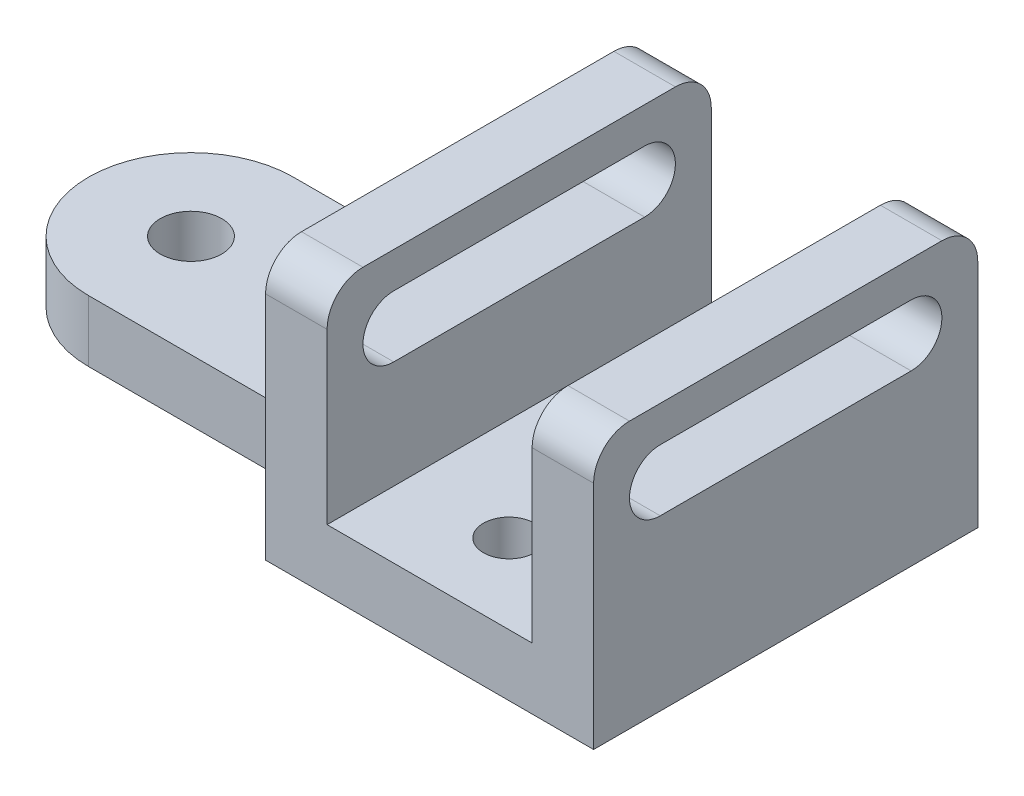
ISO-10303-21;
HEADER;
FILE_DESCRIPTION(('STEP AP214'),'2;1');
FILE_NAME('part.step','',(''),(''),'','','');
FILE_SCHEMA(('AUTOMOTIVE_DESIGN { 1 0 10303 214 1 1 1 1 }'));
ENDSEC;
DATA;
#1=APPLICATION_CONTEXT('core data for automotive mechanical design processes');
#2=APPLICATION_PROTOCOL_DEFINITION('international standard','automotive_design',2000,#1);
#3=PRODUCT_CONTEXT('',#1,'mechanical');
#4=PRODUCT('Part','Part','',(#3));
#5=PRODUCT_RELATED_PRODUCT_CATEGORY('part','',(#4));
#6=PRODUCT_DEFINITION_FORMATION('','',#4);
#7=PRODUCT_DEFINITION_CONTEXT('part definition',#1,'design');
#8=PRODUCT_DEFINITION('design','',#6,#7);
#9=PRODUCT_DEFINITION_SHAPE('','',#8);
#10=(LENGTH_UNIT() NAMED_UNIT(*) SI_UNIT(.MILLI.,.METRE.));
#11=(NAMED_UNIT(*) PLANE_ANGLE_UNIT() SI_UNIT($,.RADIAN.));
#12=(NAMED_UNIT(*) SI_UNIT($,.STERADIAN.) SOLID_ANGLE_UNIT());
#13=UNCERTAINTY_MEASURE_WITH_UNIT(LENGTH_MEASURE(1.E-05),#10,'distance_accuracy_value','');
#14=(GEOMETRIC_REPRESENTATION_CONTEXT(3) GLOBAL_UNCERTAINTY_ASSIGNED_CONTEXT((#13)) GLOBAL_UNIT_ASSIGNED_CONTEXT((#10,
#11,#12)) REPRESENTATION_CONTEXT('',''));
#15=CARTESIAN_POINT('',(0.,0.,0.));
#16=DIRECTION('',(0.,0.,1.));
#17=DIRECTION('',(1.,0.,0.));
#18=AXIS2_PLACEMENT_3D('',#15,#16,#17);
#19=CARTESIAN_POINT('',(-113.533874762292,12.,0.));
#20=DIRECTION('',(1.,0.,0.));
#21=DIRECTION('',(0.,0.,-1.));
#22=AXIS2_PLACEMENT_3D('',#19,#20,#21);
#23=PLANE('',#22);
#24=DIRECTION('',(0.,0.,1.));
#25=VECTOR('',#24,1.);
#26=CARTESIAN_POINT('',(-113.533874762292,0.,0.));
#27=LINE('',#26,#25);
#28=CARTESIAN_POINT('',(-113.533874762292,0.,-40.2426295868931));
#29=VERTEX_POINT('',#28);
#30=CARTESIAN_POINT('',(-113.533874762292,0.,-30.6817293777094));
#31=VERTEX_POINT('',#30);
#32=EDGE_CURVE('E518',#29,#31,#27,.T.);
#33=ORIENTED_EDGE('',*,*,#32,.T.);
#34=DIRECTION('',(0.,-1.,0.));
#35=VECTOR('',#34,1.);
#36=CARTESIAN_POINT('',(-113.533874762292,12.,-30.6817293777094));
#37=LINE('',#36,#35);
#38=CARTESIAN_POINT('',(-113.533874762292,12.,-30.6817293777094));
#39=VERTEX_POINT('',#38);
#40=EDGE_CURVE('E523',#39,#31,#37,.T.);
#41=ORIENTED_EDGE('',*,*,#40,.F.);
#42=DIRECTION('',(0.,0.,-1.));
#43=VECTOR('',#42,1.);
#44=CARTESIAN_POINT('',(-113.533874762292,12.,34.7573704131069));
#45=LINE('',#44,#43);
#46=CARTESIAN_POINT('',(-113.533874762292,12.,29.3182706222906));
#47=VERTEX_POINT('',#46);
#48=EDGE_CURVE('E249',#47,#39,#45,.T.);
#49=ORIENTED_EDGE('',*,*,#48,.F.);
#50=DIRECTION('',(0.,-1.,0.));
#51=VECTOR('',#50,1.);
#52=CARTESIAN_POINT('',(-113.533874762292,12.,29.3182706222906));
#53=LINE('',#52,#51);
#54=CARTESIAN_POINT('',(-113.533874762292,0.,29.3182706222906));
#55=VERTEX_POINT('',#54);
#56=EDGE_CURVE('E534',#47,#55,#53,.T.);
#57=ORIENTED_EDGE('',*,*,#56,.T.);
#58=DIRECTION('',(0.,0.,1.));
#59=VECTOR('',#58,1.);
#60=CARTESIAN_POINT('',(-113.533874762292,0.,0.));
#61=LINE('',#60,#59);
#62=CARTESIAN_POINT('',(-113.533874762292,0.,34.7573704131069));
#63=VERTEX_POINT('',#62);
#64=EDGE_CURVE('E507',#55,#63,#61,.T.);
#65=ORIENTED_EDGE('',*,*,#64,.T.);
#66=DIRECTION('',(0.,-1.,0.));
#67=VECTOR('',#66,1.);
#68=CARTESIAN_POINT('',(-113.533874762292,12.,34.7573704131069));
#69=LINE('',#68,#67);
#70=CARTESIAN_POINT('',(-113.533874762292,45.,34.7573704131069));
#71=VERTEX_POINT('',#70);
#72=EDGE_CURVE('E531',#71,#63,#69,.T.);
#73=ORIENTED_EDGE('',*,*,#72,.F.);
#74=CARTESIAN_POINT('',(-113.533874762292,45.,27.7573704131069));
#75=DIRECTION('',(1.,0.,0.));
#76=DIRECTION('',(0.,0.,1.));
#77=AXIS2_PLACEMENT_3D('',#74,#75,#76);
#78=CIRCLE('',#77,7.);
#79=CARTESIAN_POINT('',(-113.533874762292,52.,27.7573704131069));
#80=VERTEX_POINT('',#79);
#81=EDGE_CURVE('E242',#80,#71,#78,.T.);
#82=ORIENTED_EDGE('',*,*,#81,.F.);
#83=DIRECTION('',(0.,0.,1.));
#84=VECTOR('',#83,1.);
#85=CARTESIAN_POINT('',(-113.533874762292,52.,27.7573704131069));
#86=LINE('',#85,#84);
#87=CARTESIAN_POINT('',(-113.533874762292,52.,-33.1995916793253));
#88=VERTEX_POINT('',#87);
#89=EDGE_CURVE('E263',#88,#80,#86,.T.);
#90=ORIENTED_EDGE('',*,*,#89,.F.);
#91=CARTESIAN_POINT('',(-113.533874762292,45.,-33.1995916793254));
#92=DIRECTION('',(1.,0.,0.));
#93=DIRECTION('',(0.,0.,-1.));
#94=AXIS2_PLACEMENT_3D('',#91,#92,#93);
#95=CIRCLE('',#94,7.);
#96=CARTESIAN_POINT('',(-113.533874762292,45.,-40.1995916793254));
#97=VERTEX_POINT('',#96);
#98=EDGE_CURVE('E265',#97,#88,#95,.T.);
#99=ORIENTED_EDGE('',*,*,#98,.F.);
#100=DIRECTION('',(0.,1.,0.));
#101=VECTOR('',#100,1.);
#102=CARTESIAN_POINT('',(-113.533874762292,12.,-40.1995916793254));
#103=LINE('',#102,#101);
#104=CARTESIAN_POINT('',(-113.533874762292,12.,-40.1995916793254));
#105=VERTEX_POINT('',#104);
#106=EDGE_CURVE('E267',#105,#97,#103,.T.);
#107=ORIENTED_EDGE('',*,*,#106,.F.);
#108=DIRECTION('',(0.,0.,1.));
#109=VECTOR('',#108,1.);
#110=CARTESIAN_POINT('',(-113.533874762292,12.,0.));
#111=LINE('',#110,#109);
#112=CARTESIAN_POINT('',(-113.533874762292,12.,-40.2426295868931));
#113=VERTEX_POINT('',#112);
#114=EDGE_CURVE('E593',#113,#105,#111,.T.);
#115=ORIENTED_EDGE('',*,*,#114,.F.);
#116=DIRECTION('',(0.,-1.,0.));
#117=VECTOR('',#116,1.);
#118=CARTESIAN_POINT('',(-113.533874762292,12.,-40.2426295868931));
#119=LINE('',#118,#117);
#120=EDGE_CURVE('E525',#113,#29,#119,.T.);
#121=ORIENTED_EDGE('',*,*,#120,.T.);
#122=EDGE_LOOP('',(#33,#41,#49,#57,#65,#73,#82,#90,#99,#107,#115,#121));
#123=FACE_BOUND('',#122,.T.);
#124=CARTESIAN_POINT('',(-113.533874762292,39.,21.7573704131069));
#125=DIRECTION('',(1.,0.,0.));
#126=DIRECTION('',(0.,0.,-1.));
#127=AXIS2_PLACEMENT_3D('',#124,#125,#126);
#128=CIRCLE('',#127,5.99999999999999);
#129=CARTESIAN_POINT('',(-113.533874762292,45.,21.7573704131069));
#130=VERTEX_POINT('',#129);
#131=CARTESIAN_POINT('',(-113.533874762292,33.,21.7573704131069));
#132=VERTEX_POINT('',#131);
#133=EDGE_CURVE('E48',#130,#132,#128,.T.);
#134=ORIENTED_EDGE('',*,*,#133,.T.);
#135=DIRECTION('',(0.,0.,-1.));
#136=VECTOR('',#135,1.);
#137=CARTESIAN_POINT('',(-113.533874762292,33.,21.7573704131069));
#138=LINE('',#137,#136);
#139=CARTESIAN_POINT('',(-113.533874762292,33.,-27.1995916793254));
#140=VERTEX_POINT('',#139);
#141=EDGE_CURVE('E235',#132,#140,#138,.T.);
#142=ORIENTED_EDGE('',*,*,#141,.T.);
#143=CARTESIAN_POINT('',(-113.533874762292,39.,-27.1995916793254));
#144=DIRECTION('',(1.,0.,0.));
#145=DIRECTION('',(0.,0.,-1.));
#146=AXIS2_PLACEMENT_3D('',#143,#144,#145);
#147=CIRCLE('',#146,6.);
#148=CARTESIAN_POINT('',(-113.533874762292,45.,-27.1995916793254));
#149=VERTEX_POINT('',#148);
#150=EDGE_CURVE('E221',#140,#149,#147,.T.);
#151=ORIENTED_EDGE('',*,*,#150,.T.);
#152=DIRECTION('',(0.,0.,1.));
#153=VECTOR('',#152,1.);
#154=CARTESIAN_POINT('',(-113.533874762292,45.,21.7573704131069));
#155=LINE('',#154,#153);
#156=EDGE_CURVE('E230',#149,#130,#155,.T.);
#157=ORIENTED_EDGE('',*,*,#156,.T.);
#158=EDGE_LOOP('',(#134,#142,#151,#157));
#159=FACE_BOUND('',#158,.T.);
#160=ADVANCED_FACE('F33',(#123,#159),#23,.F.);
#161=CARTESIAN_POINT('',(-101.533874762292,45.,27.7573704131069));
#162=DIRECTION('',(1.,0.,0.));
#163=DIRECTION('',(0.,0.,1.));
#164=AXIS2_PLACEMENT_3D('',#161,#162,#163);
#165=PLANE('',#164);
#166=DIRECTION('',(0.,-1.,0.));
#167=VECTOR('',#166,1.);
#168=CARTESIAN_POINT('',(-101.533874762292,12.,34.7573704131069));
#169=LINE('',#168,#167);
#170=CARTESIAN_POINT('',(-101.533874762292,45.,34.7573704131069));
#171=VERTEX_POINT('',#170);
#172=CARTESIAN_POINT('',(-101.533874762292,12.,34.7573704131069));
#173=VERTEX_POINT('',#172);
#174=EDGE_CURVE('E245',#171,#173,#169,.T.);
#175=ORIENTED_EDGE('',*,*,#174,.T.);
#176=DIRECTION('',(0.,0.,-1.));
#177=VECTOR('',#176,1.);
#178=CARTESIAN_POINT('',(-101.533874762292,12.,34.7573704131069));
#179=LINE('',#178,#177);
#180=CARTESIAN_POINT('',(-101.533874762292,12.,-40.1995916793254));
#181=VERTEX_POINT('',#180);
#182=EDGE_CURVE('E257',#173,#181,#179,.T.);
#183=ORIENTED_EDGE('',*,*,#182,.T.);
#184=DIRECTION('',(0.,1.,0.));
#185=VECTOR('',#184,1.);
#186=CARTESIAN_POINT('',(-101.533874762292,12.,-40.1995916793254));
#187=LINE('',#186,#185);
#188=CARTESIAN_POINT('',(-101.533874762292,45.,-40.1995916793254));
#189=VERTEX_POINT('',#188);
#190=EDGE_CURVE('E255',#181,#189,#187,.T.);
#191=ORIENTED_EDGE('',*,*,#190,.T.);
#192=CARTESIAN_POINT('',(-101.533874762292,45.,-33.1995916793254));
#193=DIRECTION('',(1.,0.,0.));
#194=DIRECTION('',(0.,0.,-1.));
#195=AXIS2_PLACEMENT_3D('',#192,#193,#194);
#196=CIRCLE('',#195,7.);
#197=CARTESIAN_POINT('',(-101.533874762292,52.,-33.1995916793253));
#198=VERTEX_POINT('',#197);
#199=EDGE_CURVE('E253',#189,#198,#196,.T.);
#200=ORIENTED_EDGE('',*,*,#199,.T.);
#201=DIRECTION('',(0.,0.,1.));
#202=VECTOR('',#201,1.);
#203=CARTESIAN_POINT('',(-101.533874762292,52.,27.7573704131069));
#204=LINE('',#203,#202);
#205=CARTESIAN_POINT('',(-101.533874762292,52.,27.7573704131069));
#206=VERTEX_POINT('',#205);
#207=EDGE_CURVE('E251',#198,#206,#204,.T.);
#208=ORIENTED_EDGE('',*,*,#207,.T.);
#209=CARTESIAN_POINT('',(-101.533874762292,45.,27.7573704131069));
#210=DIRECTION('',(1.,0.,0.));
#211=DIRECTION('',(0.,0.,1.));
#212=AXIS2_PLACEMENT_3D('',#209,#210,#211);
#213=CIRCLE('',#212,7.);
#214=EDGE_CURVE('E248',#206,#171,#213,.T.);
#215=ORIENTED_EDGE('',*,*,#214,.T.);
#216=EDGE_LOOP('',(#175,#183,#191,#200,#208,#215));
#217=FACE_BOUND('',#216,.T.);
#218=DIRECTION('',(0.,0.,1.));
#219=VECTOR('',#218,1.);
#220=CARTESIAN_POINT('',(-101.533874762292,33.,27.7573704131069));
#221=LINE('',#220,#219);
#222=CARTESIAN_POINT('',(-101.533874762292,33.,-27.1995916793254));
#223=VERTEX_POINT('',#222);
#224=CARTESIAN_POINT('',(-101.533874762292,33.,21.7573704131069));
#225=VERTEX_POINT('',#224);
#226=EDGE_CURVE('E41',#223,#225,#221,.T.);
#227=ORIENTED_EDGE('',*,*,#226,.T.);
#228=CARTESIAN_POINT('',(-101.533874762292,39.,21.7573704131069));
#229=DIRECTION('',(1.,0.,0.));
#230=DIRECTION('',(0.,0.,-1.));
#231=AXIS2_PLACEMENT_3D('',#228,#229,#230);
#232=CIRCLE('',#231,5.99999999999999);
#233=CARTESIAN_POINT('',(-101.533874762292,45.,21.7573704131069));
#234=VERTEX_POINT('',#233);
#235=EDGE_CURVE('E11',#225,#234,#232,.F.);
#236=ORIENTED_EDGE('',*,*,#235,.T.);
#237=DIRECTION('',(0.,0.,-1.));
#238=VECTOR('',#237,1.);
#239=CARTESIAN_POINT('',(-101.533874762292,45.,27.7573704131069));
#240=LINE('',#239,#238);
#241=CARTESIAN_POINT('',(-101.533874762292,45.,-27.1995916793254));
#242=VERTEX_POINT('',#241);
#243=EDGE_CURVE('E368',#234,#242,#240,.T.);
#244=ORIENTED_EDGE('',*,*,#243,.T.);
#245=CARTESIAN_POINT('',(-101.533874762292,39.,-27.1995916793254));
#246=DIRECTION('',(1.,0.,0.));
#247=DIRECTION('',(0.,0.,-1.));
#248=AXIS2_PLACEMENT_3D('',#245,#246,#247);
#249=CIRCLE('',#248,6.);
#250=EDGE_CURVE('E224',#242,#223,#249,.F.);
#251=ORIENTED_EDGE('',*,*,#250,.T.);
#252=EDGE_LOOP('',(#227,#236,#244,#251));
#253=FACE_BOUND('',#252,.T.);
#254=ADVANCED_FACE('F430',(#217,#253),#165,.T.);
#255=CARTESIAN_POINT('',(0.,12.,0.));
#256=DIRECTION('',(0.,1.,0.));
#257=DIRECTION('',(0.,0.,1.));
#258=AXIS2_PLACEMENT_3D('',#255,#256,#257);
#259=PLANE('',#258);
#260=CARTESIAN_POINT('',(-81.533874762292,12.,19.2573704131069));
#261=DIRECTION('',(0.,1.,0.));
#262=DIRECTION('',(0.,0.,1.));
#263=AXIS2_PLACEMENT_3D('',#260,#261,#262);
#264=CIRCLE('',#263,5.);
#265=CARTESIAN_POINT('',(-81.533874762292,12.,24.2573704131069));
#266=VERTEX_POINT('',#265);
#267=EDGE_CURVE('E342',#266,#266,#264,.T.);
#268=ORIENTED_EDGE('',*,*,#267,.F.);
#269=EDGE_LOOP('',(#268));
#270=FACE_BOUND('',#269,.T.);
#271=CARTESIAN_POINT('',(-81.533874762292,12.,-24.7426295868931));
#272=DIRECTION('',(0.,1.,0.));
#273=DIRECTION('',(0.,0.,1.));
#274=AXIS2_PLACEMENT_3D('',#271,#272,#273);
#275=CIRCLE('',#274,5.);
#276=CARTESIAN_POINT('',(-81.533874762292,12.,-19.7426295868931));
#277=VERTEX_POINT('',#276);
#278=EDGE_CURVE('E482',#277,#277,#275,.T.);
#279=ORIENTED_EDGE('',*,*,#278,.F.);
#280=EDGE_LOOP('',(#279));
#281=FACE_BOUND('',#280,.T.);
#282=ORIENTED_EDGE('',*,*,#114,.T.);
#283=DIRECTION('',(-1.,0.,0.));
#284=VECTOR('',#283,1.);
#285=CARTESIAN_POINT('',(-101.533874762292,12.,-40.1995916793254));
#286=LINE('',#285,#284);
#287=EDGE_CURVE('E271',#181,#105,#286,.T.);
#288=ORIENTED_EDGE('',*,*,#287,.F.);
#289=ORIENTED_EDGE('',*,*,#182,.F.);
#290=DIRECTION('',(1.,0.,0.));
#291=VECTOR('',#290,1.);
#292=CARTESIAN_POINT('',(0.,12.,34.7573704131069));
#293=LINE('',#292,#291);
#294=CARTESIAN_POINT('',(-61.533874762292,12.,34.7573704131069));
#295=VERTEX_POINT('',#294);
#296=EDGE_CURVE('E369',#173,#295,#293,.T.);
#297=ORIENTED_EDGE('',*,*,#296,.T.);
#298=DIRECTION('',(0.,0.,-1.));
#299=VECTOR('',#298,1.);
#300=CARTESIAN_POINT('',(-61.533874762292,12.,34.7573704131069));
#301=LINE('',#300,#299);
#302=CARTESIAN_POINT('',(-61.533874762292,12.,-40.1995916793254));
#303=VERTEX_POINT('',#302);
#304=EDGE_CURVE('E310',#295,#303,#301,.T.);
#305=ORIENTED_EDGE('',*,*,#304,.T.);
#306=DIRECTION('',(1.,0.,0.));
#307=VECTOR('',#306,1.);
#308=CARTESIAN_POINT('',(-61.533874762292,12.,-40.1995916793254));
#309=LINE('',#308,#307);
#310=CARTESIAN_POINT('',(-49.533874762292,12.,-40.1995916793254));
#311=VERTEX_POINT('',#310);
#312=EDGE_CURVE('E319',#303,#311,#309,.T.);
#313=ORIENTED_EDGE('',*,*,#312,.T.);
#314=DIRECTION('',(0.,0.,1.));
#315=VECTOR('',#314,1.);
#316=CARTESIAN_POINT('',(-49.533874762292,12.,0.));
#317=LINE('',#316,#315);
#318=CARTESIAN_POINT('',(-49.533874762292,12.,-40.2426295868931));
#319=VERTEX_POINT('',#318);
#320=EDGE_CURVE('E372',#319,#311,#317,.T.);
#321=ORIENTED_EDGE('',*,*,#320,.F.);
#322=DIRECTION('',(1.,0.,0.));
#323=VECTOR('',#322,1.);
#324=CARTESIAN_POINT('',(0.,12.,-40.2426295868931));
#325=LINE('',#324,#323);
#326=EDGE_CURVE('E381',#113,#319,#325,.T.);
#327=ORIENTED_EDGE('',*,*,#326,.F.);
#328=EDGE_LOOP('',(#282,#288,#289,#297,#305,#313,#321,#327));
#329=FACE_BOUND('',#328,.T.);
#330=ADVANCED_FACE('F397',(#270,#281,#329),#259,.T.);
#331=CARTESIAN_POINT('',(-163.533874762292,12.,-0.681729377709366));
#332=DIRECTION('',(0.,1.,0.));
#333=DIRECTION('',(0.,0.,1.));
#334=AXIS2_PLACEMENT_3D('',#331,#332,#333);
#335=CIRCLE('',#334,6.00000000000002);
#336=CARTESIAN_POINT('',(-163.533874762292,12.,5.31827062229065));
#337=VERTEX_POINT('',#336);
#338=EDGE_CURVE('E526',#337,#337,#335,.T.);
#339=ORIENTED_EDGE('',*,*,#338,.F.);
#340=EDGE_LOOP('',(#339));
#341=FACE_BOUND('',#340,.T.);
#342=CARTESIAN_POINT('',(-123.533874762292,12.,29.3182706222906));
#343=DIRECTION('',(0.,1.,0.));
#344=DIRECTION('',(0.,0.,1.));
#345=AXIS2_PLACEMENT_3D('',#342,#343,#344);
#346=CIRCLE('',#345,9.99999999999999);
#347=CARTESIAN_POINT('',(-123.533874762292,12.,19.3182706222906));
#348=VERTEX_POINT('',#347);
#349=EDGE_CURVE('E373',#348,#47,#346,.F.);
#350=ORIENTED_EDGE('',*,*,#349,.T.);
#351=ORIENTED_EDGE('',*,*,#48,.T.);
#352=CARTESIAN_POINT('',(-123.533874762292,12.,-30.6817293777094));
#353=DIRECTION('',(0.,1.,0.));
#354=DIRECTION('',(0.,0.,1.));
#355=AXIS2_PLACEMENT_3D('',#352,#353,#354);
#356=CIRCLE('',#355,9.99999999999999);
#357=CARTESIAN_POINT('',(-123.533874762292,12.,-20.6817293777094));
#358=VERTEX_POINT('',#357);
#359=EDGE_CURVE('E564',#358,#39,#356,.T.);
#360=ORIENTED_EDGE('',*,*,#359,.F.);
#361=DIRECTION('',(1.,0.,0.));
#362=VECTOR('',#361,1.);
#363=CARTESIAN_POINT('',(0.,12.,-20.6817293777094));
#364=LINE('',#363,#362);
#365=CARTESIAN_POINT('',(-163.533874762292,12.,-20.6817293777094));
#366=VERTEX_POINT('',#365);
#367=EDGE_CURVE('E549',#366,#358,#364,.T.);
#368=ORIENTED_EDGE('',*,*,#367,.F.);
#369=CARTESIAN_POINT('',(-163.533874762292,12.,-0.681729377709366));
#370=DIRECTION('',(0.,1.,0.));
#371=DIRECTION('',(0.,0.,1.));
#372=AXIS2_PLACEMENT_3D('',#369,#370,#371);
#373=CIRCLE('',#372,20.);
#374=CARTESIAN_POINT('',(-163.533874762292,12.,19.3182706222906));
#375=VERTEX_POINT('',#374);
#376=EDGE_CURVE('E558',#366,#375,#373,.T.);
#377=ORIENTED_EDGE('',*,*,#376,.T.);
#378=DIRECTION('',(1.,0.,0.));
#379=VECTOR('',#378,1.);
#380=CARTESIAN_POINT('',(0.,12.,19.3182706222906));
#381=LINE('',#380,#379);
#382=EDGE_CURVE('E561',#375,#348,#381,.T.);
#383=ORIENTED_EDGE('',*,*,#382,.T.);
#384=EDGE_LOOP('',(#350,#351,#360,#368,#377,#383));
#385=FACE_BOUND('',#384,.T.);
#386=ADVANCED_FACE('F471',(#341,#385),#259,.T.);
#387=CARTESIAN_POINT('',(-123.533874762292,12.,-30.6817293777094));
#388=DIRECTION('',(0.,-1.,0.));
#389=DIRECTION('',(0.,0.,-1.));
#390=AXIS2_PLACEMENT_3D('',#387,#388,#389);
#391=CYLINDRICAL_SURFACE('',#390,9.99999999999999);
#392=CARTESIAN_POINT('',(-123.533874762292,0.,-30.6817293777094));
#393=DIRECTION('',(0.,1.,0.));
#394=DIRECTION('',(0.,0.,1.));
#395=AXIS2_PLACEMENT_3D('',#392,#393,#394);
#396=CIRCLE('',#395,9.99999999999999);
#397=CARTESIAN_POINT('',(-123.533874762292,0.,-20.6817293777094));
#398=VERTEX_POINT('',#397);
#399=EDGE_CURVE('E487',#398,#31,#396,.T.);
#400=ORIENTED_EDGE('',*,*,#399,.F.);
#401=DIRECTION('',(0.,-1.,0.));
#402=VECTOR('',#401,1.);
#403=CARTESIAN_POINT('',(-123.533874762292,12.,-20.6817293777094));
#404=LINE('',#403,#402);
#405=EDGE_CURVE('E361',#358,#398,#404,.T.);
#406=ORIENTED_EDGE('',*,*,#405,.F.);
#407=ORIENTED_EDGE('',*,*,#359,.T.);
#408=ORIENTED_EDGE('',*,*,#40,.T.);
#409=EDGE_LOOP('',(#400,#406,#407,#408));
#410=FACE_BOUND('',#409,.T.);
#411=ADVANCED_FACE('F468',(#410),#391,.F.);
#412=CARTESIAN_POINT('',(0.,12.,-20.6817293777094));
#413=DIRECTION('',(0.,0.,-1.));
#414=DIRECTION('',(-1.,0.,0.));
#415=AXIS2_PLACEMENT_3D('',#412,#413,#414);
#416=PLANE('',#415);
#417=DIRECTION('',(1.,0.,0.));
#418=VECTOR('',#417,1.);
#419=CARTESIAN_POINT('',(0.,0.,-20.6817293777094));
#420=LINE('',#419,#418);
#421=CARTESIAN_POINT('',(-163.533874762292,0.,-20.6817293777094));
#422=VERTEX_POINT('',#421);
#423=EDGE_CURVE('E490',#422,#398,#420,.T.);
#424=ORIENTED_EDGE('',*,*,#423,.F.);
#425=DIRECTION('',(0.,-1.,0.));
#426=VECTOR('',#425,1.);
#427=CARTESIAN_POINT('',(-163.533874762292,12.,-20.6817293777094));
#428=LINE('',#427,#426);
#429=EDGE_CURVE('E542',#366,#422,#428,.T.);
#430=ORIENTED_EDGE('',*,*,#429,.F.);
#431=ORIENTED_EDGE('',*,*,#367,.T.);
#432=ORIENTED_EDGE('',*,*,#405,.T.);
#433=EDGE_LOOP('',(#424,#430,#431,#432));
#434=FACE_BOUND('',#433,.T.);
#435=ADVANCED_FACE('F464',(#434),#416,.T.);
#436=CARTESIAN_POINT('',(-163.533874762292,12.,-0.681729377709366));
#437=DIRECTION('',(0.,-1.,0.));
#438=DIRECTION('',(0.,0.,-1.));
#439=AXIS2_PLACEMENT_3D('',#436,#437,#438);
#440=CYLINDRICAL_SURFACE('',#439,20.);
#441=CARTESIAN_POINT('',(-163.533874762292,0.,-0.681729377709366));
#442=DIRECTION('',(0.,1.,0.));
#443=DIRECTION('',(0.,0.,1.));
#444=AXIS2_PLACEMENT_3D('',#441,#442,#443);
#445=CIRCLE('',#444,20.);
#446=CARTESIAN_POINT('',(-163.533874762292,0.,19.3182706222906));
#447=VERTEX_POINT('',#446);
#448=EDGE_CURVE('E498',#422,#447,#445,.T.);
#449=ORIENTED_EDGE('',*,*,#448,.T.);
#450=DIRECTION('',(0.,-1.,0.));
#451=VECTOR('',#450,1.);
#452=CARTESIAN_POINT('',(-163.533874762292,12.,19.3182706222906));
#453=LINE('',#452,#451);
#454=EDGE_CURVE('E540',#375,#447,#453,.T.);
#455=ORIENTED_EDGE('',*,*,#454,.F.);
#456=ORIENTED_EDGE('',*,*,#376,.F.);
#457=ORIENTED_EDGE('',*,*,#429,.T.);
#458=EDGE_LOOP('',(#449,#455,#456,#457));
#459=FACE_BOUND('',#458,.T.);
#460=ADVANCED_FACE('F460',(#459),#440,.T.);
#461=CARTESIAN_POINT('',(0.,12.,19.3182706222906));
#462=DIRECTION('',(0.,0.,-1.));
#463=DIRECTION('',(-1.,0.,0.));
#464=AXIS2_PLACEMENT_3D('',#461,#462,#463);
#465=PLANE('',#464);
#466=DIRECTION('',(1.,0.,0.));
#467=VECTOR('',#466,1.);
#468=CARTESIAN_POINT('',(0.,0.,19.3182706222906));
#469=LINE('',#468,#467);
#470=CARTESIAN_POINT('',(-123.533874762292,0.,19.3182706222906));
#471=VERTEX_POINT('',#470);
#472=EDGE_CURVE('E501',#447,#471,#469,.T.);
#473=ORIENTED_EDGE('',*,*,#472,.T.);
#474=DIRECTION('',(0.,-1.,0.));
#475=VECTOR('',#474,1.);
#476=CARTESIAN_POINT('',(-123.533874762292,12.,19.3182706222906));
#477=LINE('',#476,#475);
#478=EDGE_CURVE('E537',#348,#471,#477,.T.);
#479=ORIENTED_EDGE('',*,*,#478,.F.);
#480=ORIENTED_EDGE('',*,*,#382,.F.);
#481=ORIENTED_EDGE('',*,*,#454,.T.);
#482=EDGE_LOOP('',(#473,#479,#480,#481));
#483=FACE_BOUND('',#482,.T.);
#484=ADVANCED_FACE('F456',(#483),#465,.F.);
#485=CARTESIAN_POINT('',(-123.533874762292,12.,29.3182706222906));
#486=DIRECTION('',(0.,-1.,0.));
#487=DIRECTION('',(0.,0.,-1.));
#488=AXIS2_PLACEMENT_3D('',#485,#486,#487);
#489=CYLINDRICAL_SURFACE('',#488,9.99999999999999);
#490=CARTESIAN_POINT('',(-123.533874762292,0.,29.3182706222906));
#491=DIRECTION('',(0.,1.,0.));
#492=DIRECTION('',(0.,0.,1.));
#493=AXIS2_PLACEMENT_3D('',#490,#491,#492);
#494=CIRCLE('',#493,9.99999999999999);
#495=EDGE_CURVE('E504',#471,#55,#494,.F.);
#496=ORIENTED_EDGE('',*,*,#495,.T.);
#497=ORIENTED_EDGE('',*,*,#56,.F.);
#498=ORIENTED_EDGE('',*,*,#349,.F.);
#499=ORIENTED_EDGE('',*,*,#478,.T.);
#500=EDGE_LOOP('',(#496,#497,#498,#499));
#501=FACE_BOUND('',#500,.T.);
#502=ADVANCED_FACE('F453',(#501),#489,.F.);
#503=CARTESIAN_POINT('',(0.,12.,34.7573704131069));
#504=DIRECTION('',(0.,0.,-1.));
#505=DIRECTION('',(-1.,0.,0.));
#506=AXIS2_PLACEMENT_3D('',#503,#504,#505);
#507=PLANE('',#506);
#508=DIRECTION('',(1.,0.,0.));
#509=VECTOR('',#508,1.);
#510=CARTESIAN_POINT('',(0.,0.,34.7573704131069));
#511=LINE('',#510,#509);
#512=CARTESIAN_POINT('',(-49.533874762292,0.,34.7573704131069));
#513=VERTEX_POINT('',#512);
#514=EDGE_CURVE('E510',#63,#513,#511,.T.);
#515=ORIENTED_EDGE('',*,*,#514,.T.);
#516=DIRECTION('',(0.,-1.,0.));
#517=VECTOR('',#516,1.);
#518=CARTESIAN_POINT('',(-49.533874762292,12.,34.7573704131069));
#519=LINE('',#518,#517);
#520=CARTESIAN_POINT('',(-49.533874762292,45.,34.7573704131069));
#521=VERTEX_POINT('',#520);
#522=EDGE_CURVE('E411',#521,#513,#519,.T.);
#523=ORIENTED_EDGE('',*,*,#522,.F.);
#524=DIRECTION('',(1.,0.,0.));
#525=VECTOR('',#524,1.);
#526=CARTESIAN_POINT('',(-61.533874762292,45.,34.7573704131069));
#527=LINE('',#526,#525);
#528=CARTESIAN_POINT('',(-61.533874762292,45.,34.7573704131069));
#529=VERTEX_POINT('',#528);
#530=EDGE_CURVE('E330',#529,#521,#527,.T.);
#531=ORIENTED_EDGE('',*,*,#530,.F.);
#532=DIRECTION('',(0.,-1.,0.));
#533=VECTOR('',#532,1.);
#534=CARTESIAN_POINT('',(-61.533874762292,12.,34.7573704131069));
#535=LINE('',#534,#533);
#536=EDGE_CURVE('E329',#529,#295,#535,.T.);
#537=ORIENTED_EDGE('',*,*,#536,.T.);
#538=ORIENTED_EDGE('',*,*,#296,.F.);
#539=ORIENTED_EDGE('',*,*,#174,.F.);
#540=DIRECTION('',(-1.,0.,0.));
#541=VECTOR('',#540,1.);
#542=CARTESIAN_POINT('',(-101.533874762292,45.,34.7573704131069));
#543=LINE('',#542,#541);
#544=EDGE_CURVE('E260',#171,#71,#543,.T.);
#545=ORIENTED_EDGE('',*,*,#544,.T.);
#546=ORIENTED_EDGE('',*,*,#72,.T.);
#547=EDGE_LOOP('',(#515,#523,#531,#537,#538,#539,#545,#546));
#548=FACE_BOUND('',#547,.T.);
#549=ADVANCED_FACE('F409',(#548),#507,.F.);
#550=CARTESIAN_POINT('',(-49.533874762292,12.,0.));
#551=DIRECTION('',(1.,0.,0.));
#552=DIRECTION('',(0.,0.,-1.));
#553=AXIS2_PLACEMENT_3D('',#550,#551,#552);
#554=PLANE('',#553);
#555=CARTESIAN_POINT('',(-49.533874762292,39.,21.7573704131069));
#556=DIRECTION('',(1.,0.,0.));
#557=DIRECTION('',(0.,0.,-1.));
#558=AXIS2_PLACEMENT_3D('',#555,#556,#557);
#559=CIRCLE('',#558,5.99999999999999);
#560=CARTESIAN_POINT('',(-49.533874762292,45.,21.7573704131069));
#561=VERTEX_POINT('',#560);
#562=CARTESIAN_POINT('',(-49.533874762292,33.,21.7573704131069));
#563=VERTEX_POINT('',#562);
#564=EDGE_CURVE('E274',#561,#563,#559,.T.);
#565=ORIENTED_EDGE('',*,*,#564,.F.);
#566=DIRECTION('',(0.,0.,1.));
#567=VECTOR('',#566,1.);
#568=CARTESIAN_POINT('',(-49.533874762292,45.,21.7573704131069));
#569=LINE('',#568,#567);
#570=CARTESIAN_POINT('',(-49.533874762292,45.,-27.1995916793254));
#571=VERTEX_POINT('',#570);
#572=EDGE_CURVE('E293',#571,#561,#569,.T.);
#573=ORIENTED_EDGE('',*,*,#572,.F.);
#574=CARTESIAN_POINT('',(-49.533874762292,39.,-27.1995916793254));
#575=DIRECTION('',(1.,0.,0.));
#576=DIRECTION('',(0.,0.,-1.));
#577=AXIS2_PLACEMENT_3D('',#574,#575,#576);
#578=CIRCLE('',#577,6.);
#579=CARTESIAN_POINT('',(-49.533874762292,33.,-27.1995916793254));
#580=VERTEX_POINT('',#579);
#581=EDGE_CURVE('E290',#580,#571,#578,.T.);
#582=ORIENTED_EDGE('',*,*,#581,.F.);
#583=DIRECTION('',(0.,0.,-1.));
#584=VECTOR('',#583,1.);
#585=CARTESIAN_POINT('',(-49.533874762292,33.,21.7573704131069));
#586=LINE('',#585,#584);
#587=EDGE_CURVE('E287',#563,#580,#586,.T.);
#588=ORIENTED_EDGE('',*,*,#587,.F.);
#589=EDGE_LOOP('',(#565,#573,#582,#588));
#590=FACE_BOUND('',#589,.T.);
#591=DIRECTION('',(0.,0.,1.));
#592=VECTOR('',#591,1.);
#593=CARTESIAN_POINT('',(-49.533874762292,0.,0.));
#594=LINE('',#593,#592);
#595=CARTESIAN_POINT('',(-49.533874762292,0.,-40.2426295868931));
#596=VERTEX_POINT('',#595);
#597=EDGE_CURVE('E512',#596,#513,#594,.T.);
#598=ORIENTED_EDGE('',*,*,#597,.F.);
#599=DIRECTION('',(0.,-1.,0.));
#600=VECTOR('',#599,1.);
#601=CARTESIAN_POINT('',(-49.533874762292,12.,-40.2426295868931));
#602=LINE('',#601,#600);
#603=EDGE_CURVE('E528',#319,#596,#602,.T.);
#604=ORIENTED_EDGE('',*,*,#603,.F.);
#605=ORIENTED_EDGE('',*,*,#320,.T.);
#606=DIRECTION('',(0.,1.,0.));
#607=VECTOR('',#606,1.);
#608=CARTESIAN_POINT('',(-49.533874762292,12.,-40.1995916793254));
#609=LINE('',#608,#607);
#610=CARTESIAN_POINT('',(-49.533874762292,45.,-40.1995916793254));
#611=VERTEX_POINT('',#610);
#612=EDGE_CURVE('E299',#311,#611,#609,.T.);
#613=ORIENTED_EDGE('',*,*,#612,.T.);
#614=CARTESIAN_POINT('',(-49.533874762292,45.,-33.1995916793254));
#615=DIRECTION('',(1.,0.,0.));
#616=DIRECTION('',(0.,0.,-1.));
#617=AXIS2_PLACEMENT_3D('',#614,#615,#616);
#618=CIRCLE('',#617,7.);
#619=CARTESIAN_POINT('',(-49.533874762292,52.,-33.1995916793254));
#620=VERTEX_POINT('',#619);
#621=EDGE_CURVE('E320',#611,#620,#618,.T.);
#622=ORIENTED_EDGE('',*,*,#621,.T.);
#623=DIRECTION('',(0.,0.,1.));
#624=VECTOR('',#623,1.);
#625=CARTESIAN_POINT('',(-49.533874762292,52.,27.7573704131069));
#626=LINE('',#625,#624);
#627=CARTESIAN_POINT('',(-49.533874762292,52.,27.7573704131069));
#628=VERTEX_POINT('',#627);
#629=EDGE_CURVE('E323',#620,#628,#626,.T.);
#630=ORIENTED_EDGE('',*,*,#629,.T.);
#631=CARTESIAN_POINT('',(-49.533874762292,45.,27.7573704131069));
#632=DIRECTION('',(1.,0.,0.));
#633=DIRECTION('',(0.,0.,1.));
#634=AXIS2_PLACEMENT_3D('',#631,#632,#633);
#635=CIRCLE('',#634,7.);
#636=EDGE_CURVE('E326',#628,#521,#635,.T.);
#637=ORIENTED_EDGE('',*,*,#636,.T.);
#638=ORIENTED_EDGE('',*,*,#522,.T.);
#639=EDGE_LOOP('',(#598,#604,#605,#613,#622,#630,#637,#638));
#640=FACE_BOUND('',#639,.T.);
#641=ADVANCED_FACE('F390',(#590,#640),#554,.T.);
#642=CARTESIAN_POINT('',(0.,12.,-40.2426295868931));
#643=DIRECTION('',(0.,0.,-1.));
#644=DIRECTION('',(-1.,0.,0.));
#645=AXIS2_PLACEMENT_3D('',#642,#643,#644);
#646=PLANE('',#645);
#647=DIRECTION('',(1.,0.,0.));
#648=VECTOR('',#647,1.);
#649=CARTESIAN_POINT('',(0.,0.,-40.2426295868931));
#650=LINE('',#649,#648);
#651=EDGE_CURVE('E515',#29,#596,#650,.T.);
#652=ORIENTED_EDGE('',*,*,#651,.F.);
#653=ORIENTED_EDGE('',*,*,#120,.F.);
#654=ORIENTED_EDGE('',*,*,#326,.T.);
#655=ORIENTED_EDGE('',*,*,#603,.T.);
#656=EDGE_LOOP('',(#652,#653,#654,#655));
#657=FACE_BOUND('',#656,.T.);
#658=ADVANCED_FACE('F443',(#657),#646,.T.);
#659=CARTESIAN_POINT('',(-81.533874762292,12.,-24.7426295868931));
#660=DIRECTION('',(0.,-1.,0.));
#661=DIRECTION('',(0.,0.,-1.));
#662=AXIS2_PLACEMENT_3D('',#659,#660,#661);
#663=CYLINDRICAL_SURFACE('',#662,5.);
#664=ORIENTED_EDGE('',*,*,#278,.T.);
#665=EDGE_LOOP('',(#664));
#666=FACE_BOUND('',#665,.T.);
#667=CARTESIAN_POINT('',(-81.533874762292,0.,-24.7426295868931));
#668=DIRECTION('',(0.,1.,0.));
#669=DIRECTION('',(0.,0.,1.));
#670=AXIS2_PLACEMENT_3D('',#667,#668,#669);
#671=CIRCLE('',#670,5.);
#672=CARTESIAN_POINT('',(-81.533874762292,0.,-19.7426295868931));
#673=VERTEX_POINT('',#672);
#674=EDGE_CURVE('E485',#673,#673,#671,.T.);
#675=ORIENTED_EDGE('',*,*,#674,.F.);
#676=EDGE_LOOP('',(#675));
#677=FACE_BOUND('',#676,.T.);
#678=ADVANCED_FACE('F446',(#666,#677),#663,.F.);
#679=CARTESIAN_POINT('',(-81.533874762292,12.,19.2573704131069));
#680=DIRECTION('',(0.,-1.,0.));
#681=DIRECTION('',(0.,0.,-1.));
#682=AXIS2_PLACEMENT_3D('',#679,#680,#681);
#683=CYLINDRICAL_SURFACE('',#682,5.);
#684=ORIENTED_EDGE('',*,*,#267,.T.);
#685=EDGE_LOOP('',(#684));
#686=FACE_BOUND('',#685,.T.);
#687=CARTESIAN_POINT('',(-81.533874762292,0.,19.2573704131069));
#688=DIRECTION('',(0.,1.,0.));
#689=DIRECTION('',(0.,0.,1.));
#690=AXIS2_PLACEMENT_3D('',#687,#688,#689);
#691=CIRCLE('',#690,5.);
#692=CARTESIAN_POINT('',(-81.533874762292,0.,24.2573704131069));
#693=VERTEX_POINT('',#692);
#694=EDGE_CURVE('E333',#693,#693,#691,.T.);
#695=ORIENTED_EDGE('',*,*,#694,.F.);
#696=EDGE_LOOP('',(#695));
#697=FACE_BOUND('',#696,.T.);
#698=ADVANCED_FACE('F35',(#686,#697),#683,.F.);
#699=CARTESIAN_POINT('',(-163.533874762292,12.,-0.681729377709366));
#700=DIRECTION('',(0.,-1.,0.));
#701=DIRECTION('',(0.,0.,-1.));
#702=AXIS2_PLACEMENT_3D('',#699,#700,#701);
#703=CYLINDRICAL_SURFACE('',#702,6.00000000000002);
#704=ORIENTED_EDGE('',*,*,#338,.T.);
#705=EDGE_LOOP('',(#704));
#706=FACE_BOUND('',#705,.T.);
#707=CARTESIAN_POINT('',(-163.533874762292,0.,-0.681729377709366));
#708=DIRECTION('',(0.,1.,0.));
#709=DIRECTION('',(0.,0.,1.));
#710=AXIS2_PLACEMENT_3D('',#707,#708,#709);
#711=CIRCLE('',#710,6.00000000000002);
#712=CARTESIAN_POINT('',(-163.533874762292,0.,5.31827062229065));
#713=VERTEX_POINT('',#712);
#714=EDGE_CURVE('E520',#713,#713,#711,.T.);
#715=ORIENTED_EDGE('',*,*,#714,.F.);
#716=EDGE_LOOP('',(#715));
#717=FACE_BOUND('',#716,.T.);
#718=ADVANCED_FACE('F441',(#706,#717),#703,.F.);
#719=CARTESIAN_POINT('',(0.,0.,0.));
#720=DIRECTION('',(0.,1.,0.));
#721=DIRECTION('',(0.,0.,1.));
#722=AXIS2_PLACEMENT_3D('',#719,#720,#721);
#723=PLANE('',#722);
#724=ORIENTED_EDGE('',*,*,#694,.T.);
#725=EDGE_LOOP('',(#724));
#726=FACE_BOUND('',#725,.T.);
#727=ORIENTED_EDGE('',*,*,#674,.T.);
#728=EDGE_LOOP('',(#727));
#729=FACE_BOUND('',#728,.T.);
#730=ORIENTED_EDGE('',*,*,#399,.T.);
#731=ORIENTED_EDGE('',*,*,#32,.F.);
#732=ORIENTED_EDGE('',*,*,#651,.T.);
#733=ORIENTED_EDGE('',*,*,#597,.T.);
#734=ORIENTED_EDGE('',*,*,#514,.F.);
#735=ORIENTED_EDGE('',*,*,#64,.F.);
#736=ORIENTED_EDGE('',*,*,#495,.F.);
#737=ORIENTED_EDGE('',*,*,#472,.F.);
#738=ORIENTED_EDGE('',*,*,#448,.F.);
#739=ORIENTED_EDGE('',*,*,#423,.T.);
#740=EDGE_LOOP('',(#730,#731,#732,#733,#734,#735,#736,#737,#738,#739));
#741=FACE_BOUND('',#740,.T.);
#742=ORIENTED_EDGE('',*,*,#714,.T.);
#743=EDGE_LOOP('',(#742));
#744=FACE_BOUND('',#743,.T.);
#745=ADVANCED_FACE('F554',(#726,#729,#741,#744),#723,.F.);
#746=CARTESIAN_POINT('',(-61.533874762292,45.,27.7573704131069));
#747=DIRECTION('',(1.,0.,0.));
#748=DIRECTION('',(0.,0.,-1.));
#749=AXIS2_PLACEMENT_3D('',#746,#747,#748);
#750=CYLINDRICAL_SURFACE('',#749,7.);
#751=ORIENTED_EDGE('',*,*,#636,.F.);
#752=DIRECTION('',(1.,0.,0.));
#753=VECTOR('',#752,1.);
#754=CARTESIAN_POINT('',(-61.533874762292,52.,27.7573704131069));
#755=LINE('',#754,#753);
#756=CARTESIAN_POINT('',(-61.533874762292,52.,27.7573704131069));
#757=VERTEX_POINT('',#756);
#758=EDGE_CURVE('E334',#757,#628,#755,.T.);
#759=ORIENTED_EDGE('',*,*,#758,.F.);
#760=CARTESIAN_POINT('',(-61.533874762292,45.,27.7573704131069));
#761=DIRECTION('',(1.,0.,0.));
#762=DIRECTION('',(0.,0.,1.));
#763=AXIS2_PLACEMENT_3D('',#760,#761,#762);
#764=CIRCLE('',#763,7.);
#765=EDGE_CURVE('E316',#757,#529,#764,.T.);
#766=ORIENTED_EDGE('',*,*,#765,.T.);
#767=ORIENTED_EDGE('',*,*,#530,.T.);
#768=EDGE_LOOP('',(#751,#759,#766,#767));
#769=FACE_BOUND('',#768,.T.);
#770=ADVANCED_FACE('F414',(#769),#750,.T.);
#771=CARTESIAN_POINT('',(-61.533874762292,52.,27.7573704131069));
#772=DIRECTION('',(0.,1.,0.));
#773=DIRECTION('',(0.,0.,1.));
#774=AXIS2_PLACEMENT_3D('',#771,#772,#773);
#775=PLANE('',#774);
#776=ORIENTED_EDGE('',*,*,#629,.F.);
#777=DIRECTION('',(1.,0.,0.));
#778=VECTOR('',#777,1.);
#779=CARTESIAN_POINT('',(-61.533874762292,52.,-33.1995916793254));
#780=LINE('',#779,#778);
#781=CARTESIAN_POINT('',(-61.533874762292,52.,-33.1995916793254));
#782=VERTEX_POINT('',#781);
#783=EDGE_CURVE('E336',#782,#620,#780,.T.);
#784=ORIENTED_EDGE('',*,*,#783,.F.);
#785=DIRECTION('',(0.,0.,1.));
#786=VECTOR('',#785,1.);
#787=CARTESIAN_POINT('',(-61.533874762292,52.,27.7573704131069));
#788=LINE('',#787,#786);
#789=EDGE_CURVE('E313',#782,#757,#788,.T.);
#790=ORIENTED_EDGE('',*,*,#789,.T.);
#791=ORIENTED_EDGE('',*,*,#758,.T.);
#792=EDGE_LOOP('',(#776,#784,#790,#791));
#793=FACE_BOUND('',#792,.T.);
#794=ADVANCED_FACE('F417',(#793),#775,.T.);
#795=CARTESIAN_POINT('',(-61.533874762292,45.,-33.1995916793254));
#796=DIRECTION('',(1.,0.,0.));
#797=DIRECTION('',(0.,0.,-1.));
#798=AXIS2_PLACEMENT_3D('',#795,#796,#797);
#799=CYLINDRICAL_SURFACE('',#798,7.);
#800=ORIENTED_EDGE('',*,*,#621,.F.);
#801=DIRECTION('',(1.,0.,0.));
#802=VECTOR('',#801,1.);
#803=CARTESIAN_POINT('',(-61.533874762292,45.,-40.1995916793254));
#804=LINE('',#803,#802);
#805=CARTESIAN_POINT('',(-61.533874762292,45.,-40.1995916793254));
#806=VERTEX_POINT('',#805);
#807=EDGE_CURVE('E338',#806,#611,#804,.T.);
#808=ORIENTED_EDGE('',*,*,#807,.F.);
#809=CARTESIAN_POINT('',(-61.533874762292,45.,-33.1995916793254));
#810=DIRECTION('',(1.,0.,0.));
#811=DIRECTION('',(0.,0.,-1.));
#812=AXIS2_PLACEMENT_3D('',#809,#810,#811);
#813=CIRCLE('',#812,7.);
#814=EDGE_CURVE('E309',#806,#782,#813,.T.);
#815=ORIENTED_EDGE('',*,*,#814,.T.);
#816=ORIENTED_EDGE('',*,*,#783,.T.);
#817=EDGE_LOOP('',(#800,#808,#815,#816));
#818=FACE_BOUND('',#817,.T.);
#819=ADVANCED_FACE('F420',(#818),#799,.T.);
#820=CARTESIAN_POINT('',(-61.533874762292,12.,-40.1995916793254));
#821=DIRECTION('',(0.,0.,-1.));
#822=DIRECTION('',(-1.,0.,0.));
#823=AXIS2_PLACEMENT_3D('',#820,#821,#822);
#824=PLANE('',#823);
#825=ORIENTED_EDGE('',*,*,#612,.F.);
#826=ORIENTED_EDGE('',*,*,#312,.F.);
#827=DIRECTION('',(0.,1.,0.));
#828=VECTOR('',#827,1.);
#829=CARTESIAN_POINT('',(-61.533874762292,12.,-40.1995916793254));
#830=LINE('',#829,#828);
#831=EDGE_CURVE('E306',#303,#806,#830,.T.);
#832=ORIENTED_EDGE('',*,*,#831,.T.);
#833=ORIENTED_EDGE('',*,*,#807,.T.);
#834=EDGE_LOOP('',(#825,#826,#832,#833));
#835=FACE_BOUND('',#834,.T.);
#836=ADVANCED_FACE('F394',(#835),#824,.T.);
#837=CARTESIAN_POINT('',(-61.533874762292,45.,27.7573704131069));
#838=DIRECTION('',(-1.,0.,0.));
#839=DIRECTION('',(0.,0.,1.));
#840=AXIS2_PLACEMENT_3D('',#837,#838,#839);
#841=PLANE('',#840);
#842=CARTESIAN_POINT('',(-61.533874762292,39.,21.7573704131069));
#843=DIRECTION('',(-1.,0.,0.));
#844=DIRECTION('',(0.,0.,1.));
#845=AXIS2_PLACEMENT_3D('',#842,#843,#844);
#846=CIRCLE('',#845,5.99999999999999);
#847=CARTESIAN_POINT('',(-61.533874762292,33.,21.7573704131069));
#848=VERTEX_POINT('',#847);
#849=CARTESIAN_POINT('',(-61.533874762292,45.,21.7573704131069));
#850=VERTEX_POINT('',#849);
#851=EDGE_CURVE('E366',#848,#850,#846,.T.);
#852=ORIENTED_EDGE('',*,*,#851,.F.);
#853=DIRECTION('',(0.,0.,1.));
#854=VECTOR('',#853,1.);
#855=CARTESIAN_POINT('',(-61.533874762292,33.,27.7573704131069));
#856=LINE('',#855,#854);
#857=CARTESIAN_POINT('',(-61.533874762292,33.,-27.1995916793254));
#858=VERTEX_POINT('',#857);
#859=EDGE_CURVE('E358',#858,#848,#856,.T.);
#860=ORIENTED_EDGE('',*,*,#859,.F.);
#861=CARTESIAN_POINT('',(-61.533874762292,39.,-27.1995916793254));
#862=DIRECTION('',(-1.,0.,0.));
#863=DIRECTION('',(0.,0.,1.));
#864=AXIS2_PLACEMENT_3D('',#861,#862,#863);
#865=CIRCLE('',#864,6.);
#866=CARTESIAN_POINT('',(-61.533874762292,45.,-27.1995916793254));
#867=VERTEX_POINT('',#866);
#868=EDGE_CURVE('E360',#867,#858,#865,.T.);
#869=ORIENTED_EDGE('',*,*,#868,.F.);
#870=DIRECTION('',(0.,0.,-1.));
#871=VECTOR('',#870,1.);
#872=CARTESIAN_POINT('',(-61.533874762292,45.,27.7573704131069));
#873=LINE('',#872,#871);
#874=EDGE_CURVE('E364',#850,#867,#873,.T.);
#875=ORIENTED_EDGE('',*,*,#874,.F.);
#876=EDGE_LOOP('',(#852,#860,#869,#875));
#877=FACE_BOUND('',#876,.T.);
#878=ORIENTED_EDGE('',*,*,#536,.F.);
#879=ORIENTED_EDGE('',*,*,#765,.F.);
#880=ORIENTED_EDGE('',*,*,#789,.F.);
#881=ORIENTED_EDGE('',*,*,#814,.F.);
#882=ORIENTED_EDGE('',*,*,#831,.F.);
#883=ORIENTED_EDGE('',*,*,#304,.F.);
#884=EDGE_LOOP('',(#878,#879,#880,#881,#882,#883));
#885=FACE_BOUND('',#884,.T.);
#886=ADVANCED_FACE('F404',(#877,#885),#841,.T.);
#887=CARTESIAN_POINT('',(-183.533874762292,39.,21.7573704131069));
#888=DIRECTION('',(1.,0.,0.));
#889=DIRECTION('',(0.,0.,-1.));
#890=AXIS2_PLACEMENT_3D('',#887,#888,#889);
#891=CYLINDRICAL_SURFACE('',#890,5.99999999999999);
#892=ORIENTED_EDGE('',*,*,#851,.T.);
#893=DIRECTION('',(1.,0.,0.));
#894=VECTOR('',#893,1.);
#895=CARTESIAN_POINT('',(-183.533874762292,45.,21.7573704131069));
#896=LINE('',#895,#894);
#897=EDGE_CURVE('E297',#850,#561,#896,.T.);
#898=ORIENTED_EDGE('',*,*,#897,.T.);
#899=ORIENTED_EDGE('',*,*,#564,.T.);
#900=DIRECTION('',(1.,0.,0.));
#901=VECTOR('',#900,1.);
#902=CARTESIAN_POINT('',(-183.533874762292,33.,21.7573704131069));
#903=LINE('',#902,#901);
#904=EDGE_CURVE('E296',#848,#563,#903,.T.);
#905=ORIENTED_EDGE('',*,*,#904,.F.);
#906=EDGE_LOOP('',(#892,#898,#899,#905));
#907=FACE_BOUND('',#906,.T.);
#908=ADVANCED_FACE('F634',(#907),#891,.F.);
#909=CARTESIAN_POINT('',(-183.533874762292,45.,21.7573704131069));
#910=DIRECTION('',(0.,1.,0.));
#911=DIRECTION('',(0.,0.,1.));
#912=AXIS2_PLACEMENT_3D('',#909,#910,#911);
#913=PLANE('',#912);
#914=ORIENTED_EDGE('',*,*,#874,.T.);
#915=DIRECTION('',(1.,0.,0.));
#916=VECTOR('',#915,1.);
#917=CARTESIAN_POINT('',(-183.533874762292,45.,-27.1995916793254));
#918=LINE('',#917,#916);
#919=EDGE_CURVE('E300',#867,#571,#918,.T.);
#920=ORIENTED_EDGE('',*,*,#919,.T.);
#921=ORIENTED_EDGE('',*,*,#572,.T.);
#922=ORIENTED_EDGE('',*,*,#897,.F.);
#923=EDGE_LOOP('',(#914,#920,#921,#922));
#924=FACE_BOUND('',#923,.T.);
#925=ADVANCED_FACE('F630',(#924),#913,.F.);
#926=CARTESIAN_POINT('',(-183.533874762292,39.,-27.1995916793254));
#927=DIRECTION('',(1.,0.,0.));
#928=DIRECTION('',(0.,0.,-1.));
#929=AXIS2_PLACEMENT_3D('',#926,#927,#928);
#930=CYLINDRICAL_SURFACE('',#929,6.);
#931=ORIENTED_EDGE('',*,*,#868,.T.);
#932=DIRECTION('',(1.,0.,0.));
#933=VECTOR('',#932,1.);
#934=CARTESIAN_POINT('',(-183.533874762292,33.,-27.1995916793254));
#935=LINE('',#934,#933);
#936=EDGE_CURVE('E302',#858,#580,#935,.T.);
#937=ORIENTED_EDGE('',*,*,#936,.T.);
#938=ORIENTED_EDGE('',*,*,#581,.T.);
#939=ORIENTED_EDGE('',*,*,#919,.F.);
#940=EDGE_LOOP('',(#931,#937,#938,#939));
#941=FACE_BOUND('',#940,.T.);
#942=ADVANCED_FACE('F633',(#941),#930,.F.);
#943=CARTESIAN_POINT('',(-183.533874762292,33.,21.7573704131069));
#944=DIRECTION('',(0.,-1.,0.));
#945=DIRECTION('',(0.,0.,-1.));
#946=AXIS2_PLACEMENT_3D('',#943,#944,#945);
#947=PLANE('',#946);
#948=ORIENTED_EDGE('',*,*,#859,.T.);
#949=ORIENTED_EDGE('',*,*,#904,.T.);
#950=ORIENTED_EDGE('',*,*,#587,.T.);
#951=ORIENTED_EDGE('',*,*,#936,.F.);
#952=EDGE_LOOP('',(#948,#949,#950,#951));
#953=FACE_BOUND('',#952,.T.);
#954=ADVANCED_FACE('F638',(#953),#947,.F.);
#955=CARTESIAN_POINT('',(-101.533874762292,12.,-40.1995916793254));
#956=DIRECTION('',(0.,0.,1.));
#957=DIRECTION('',(1.,0.,0.));
#958=AXIS2_PLACEMENT_3D('',#955,#956,#957);
#959=PLANE('',#958);
#960=ORIENTED_EDGE('',*,*,#106,.T.);
#961=DIRECTION('',(-1.,0.,0.));
#962=VECTOR('',#961,1.);
#963=CARTESIAN_POINT('',(-101.533874762292,45.,-40.1995916793254));
#964=LINE('',#963,#962);
#965=EDGE_CURVE('E275',#189,#97,#964,.T.);
#966=ORIENTED_EDGE('',*,*,#965,.F.);
#967=ORIENTED_EDGE('',*,*,#190,.F.);
#968=ORIENTED_EDGE('',*,*,#287,.T.);
#969=EDGE_LOOP('',(#960,#966,#967,#968));
#970=FACE_BOUND('',#969,.T.);
#971=ADVANCED_FACE('F601',(#970),#959,.F.);
#972=CARTESIAN_POINT('',(-101.533874762292,45.,-33.1995916793254));
#973=DIRECTION('',(-1.,0.,0.));
#974=DIRECTION('',(0.,0.,1.));
#975=AXIS2_PLACEMENT_3D('',#972,#973,#974);
#976=CYLINDRICAL_SURFACE('',#975,7.);
#977=ORIENTED_EDGE('',*,*,#98,.T.);
#978=DIRECTION('',(-1.,0.,0.));
#979=VECTOR('',#978,1.);
#980=CARTESIAN_POINT('',(-101.533874762292,52.,-33.1995916793253));
#981=LINE('',#980,#979);
#982=EDGE_CURVE('E278',#198,#88,#981,.T.);
#983=ORIENTED_EDGE('',*,*,#982,.F.);
#984=ORIENTED_EDGE('',*,*,#199,.F.);
#985=ORIENTED_EDGE('',*,*,#965,.T.);
#986=EDGE_LOOP('',(#977,#983,#984,#985));
#987=FACE_BOUND('',#986,.T.);
#988=ADVANCED_FACE('F605',(#987),#976,.T.);
#989=CARTESIAN_POINT('',(-101.533874762292,52.,27.7573704131069));
#990=DIRECTION('',(0.,-1.,0.));
#991=DIRECTION('',(0.,0.,-1.));
#992=AXIS2_PLACEMENT_3D('',#989,#990,#991);
#993=PLANE('',#992);
#994=ORIENTED_EDGE('',*,*,#89,.T.);
#995=DIRECTION('',(-1.,0.,0.));
#996=VECTOR('',#995,1.);
#997=CARTESIAN_POINT('',(-101.533874762292,52.,27.7573704131069));
#998=LINE('',#997,#996);
#999=EDGE_CURVE('E281',#206,#80,#998,.T.);
#1000=ORIENTED_EDGE('',*,*,#999,.F.);
#1001=ORIENTED_EDGE('',*,*,#207,.F.);
#1002=ORIENTED_EDGE('',*,*,#982,.T.);
#1003=EDGE_LOOP('',(#994,#1000,#1001,#1002));
#1004=FACE_BOUND('',#1003,.T.);
#1005=ADVANCED_FACE('F618',(#1004),#993,.F.);
#1006=CARTESIAN_POINT('',(-101.533874762292,45.,27.7573704131069));
#1007=DIRECTION('',(-1.,0.,0.));
#1008=DIRECTION('',(0.,0.,1.));
#1009=AXIS2_PLACEMENT_3D('',#1006,#1007,#1008);
#1010=CYLINDRICAL_SURFACE('',#1009,7.);
#1011=ORIENTED_EDGE('',*,*,#81,.T.);
#1012=ORIENTED_EDGE('',*,*,#544,.F.);
#1013=ORIENTED_EDGE('',*,*,#214,.F.);
#1014=ORIENTED_EDGE('',*,*,#999,.T.);
#1015=EDGE_LOOP('',(#1011,#1012,#1013,#1014));
#1016=FACE_BOUND('',#1015,.T.);
#1017=ADVANCED_FACE('F613',(#1016),#1010,.T.);
#1018=CARTESIAN_POINT('',(-49.533824762292,39.,21.7573704131069));
#1019=DIRECTION('',(-1.,0.,0.));
#1020=DIRECTION('',(0.,0.,1.));
#1021=AXIS2_PLACEMENT_3D('',#1018,#1019,#1020);
#1022=CYLINDRICAL_SURFACE('',#1021,5.99999999999999);
#1023=DIRECTION('',(-1.,0.,0.));
#1024=VECTOR('',#1023,1.);
#1025=CARTESIAN_POINT('',(-49.533824762292,33.,21.7573704131069));
#1026=LINE('',#1025,#1024);
#1027=EDGE_CURVE('E240',#225,#132,#1026,.T.);
#1028=ORIENTED_EDGE('',*,*,#1027,.T.);
#1029=ORIENTED_EDGE('',*,*,#133,.F.);
#1030=DIRECTION('',(-1.,0.,0.));
#1031=VECTOR('',#1030,1.);
#1032=CARTESIAN_POINT('',(-49.533824762292,45.,21.7573704131069));
#1033=LINE('',#1032,#1031);
#1034=EDGE_CURVE('E227',#234,#130,#1033,.T.);
#1035=ORIENTED_EDGE('',*,*,#1034,.F.);
#1036=ORIENTED_EDGE('',*,*,#235,.F.);
#1037=EDGE_LOOP('',(#1028,#1029,#1035,#1036));
#1038=FACE_BOUND('',#1037,.T.);
#1039=ADVANCED_FACE('F625',(#1038),#1022,.F.);
#1040=CARTESIAN_POINT('',(-49.533824762292,33.,21.7573704131069));
#1041=DIRECTION('',(0.,1.,0.));
#1042=DIRECTION('',(0.,0.,1.));
#1043=AXIS2_PLACEMENT_3D('',#1040,#1041,#1042);
#1044=PLANE('',#1043);
#1045=DIRECTION('',(-1.,0.,0.));
#1046=VECTOR('',#1045,1.);
#1047=CARTESIAN_POINT('',(-49.533824762292,33.,-27.1995916793254));
#1048=LINE('',#1047,#1046);
#1049=EDGE_CURVE('E226',#223,#140,#1048,.T.);
#1050=ORIENTED_EDGE('',*,*,#1049,.T.);
#1051=ORIENTED_EDGE('',*,*,#141,.F.);
#1052=ORIENTED_EDGE('',*,*,#1027,.F.);
#1053=ORIENTED_EDGE('',*,*,#226,.F.);
#1054=EDGE_LOOP('',(#1050,#1051,#1052,#1053));
#1055=FACE_BOUND('',#1054,.T.);
#1056=ADVANCED_FACE('F710',(#1055),#1044,.T.);
#1057=CARTESIAN_POINT('',(-49.533824762292,39.,-27.1995916793254));
#1058=DIRECTION('',(-1.,0.,0.));
#1059=DIRECTION('',(0.,0.,1.));
#1060=AXIS2_PLACEMENT_3D('',#1057,#1058,#1059);
#1061=CYLINDRICAL_SURFACE('',#1060,6.);
#1062=DIRECTION('',(-1.,0.,0.));
#1063=VECTOR('',#1062,1.);
#1064=CARTESIAN_POINT('',(-49.533824762292,45.,-27.1995916793254));
#1065=LINE('',#1064,#1063);
#1066=EDGE_CURVE('E56',#242,#149,#1065,.T.);
#1067=ORIENTED_EDGE('',*,*,#1066,.T.);
#1068=ORIENTED_EDGE('',*,*,#150,.F.);
#1069=ORIENTED_EDGE('',*,*,#1049,.F.);
#1070=ORIENTED_EDGE('',*,*,#250,.F.);
#1071=EDGE_LOOP('',(#1067,#1068,#1069,#1070));
#1072=FACE_BOUND('',#1071,.T.);
#1073=ADVANCED_FACE('F218',(#1072),#1061,.F.);
#1074=CARTESIAN_POINT('',(-49.533824762292,45.,21.7573704131069));
#1075=DIRECTION('',(0.,-1.,0.));
#1076=DIRECTION('',(0.,0.,-1.));
#1077=AXIS2_PLACEMENT_3D('',#1074,#1075,#1076);
#1078=PLANE('',#1077);
#1079=ORIENTED_EDGE('',*,*,#1034,.T.);
#1080=ORIENTED_EDGE('',*,*,#156,.F.);
#1081=ORIENTED_EDGE('',*,*,#1066,.F.);
#1082=ORIENTED_EDGE('',*,*,#243,.F.);
#1083=EDGE_LOOP('',(#1079,#1080,#1081,#1082));
#1084=FACE_BOUND('',#1083,.T.);
#1085=ADVANCED_FACE('F231',(#1084),#1078,.T.);
#1086=CLOSED_SHELL('',(#160,#254,#330,#386,#411,#435,#460,#484,#502,#549,#641,#658,#678,#698,
#718,#745,#770,#794,#819,#836,#886,#908,#925,#942,#954,#971,#988,#1005,#1017,#1039,#1056,#1073,#1085));
#1087=MANIFOLD_SOLID_BREP('B2',#1086);
#1088=ADVANCED_BREP_SHAPE_REPRESENTATION('',(#18,#1087),#14);
#1089=SHAPE_DEFINITION_REPRESENTATION(#9,#1088);
ENDSEC;
END-ISO-10303-21;
